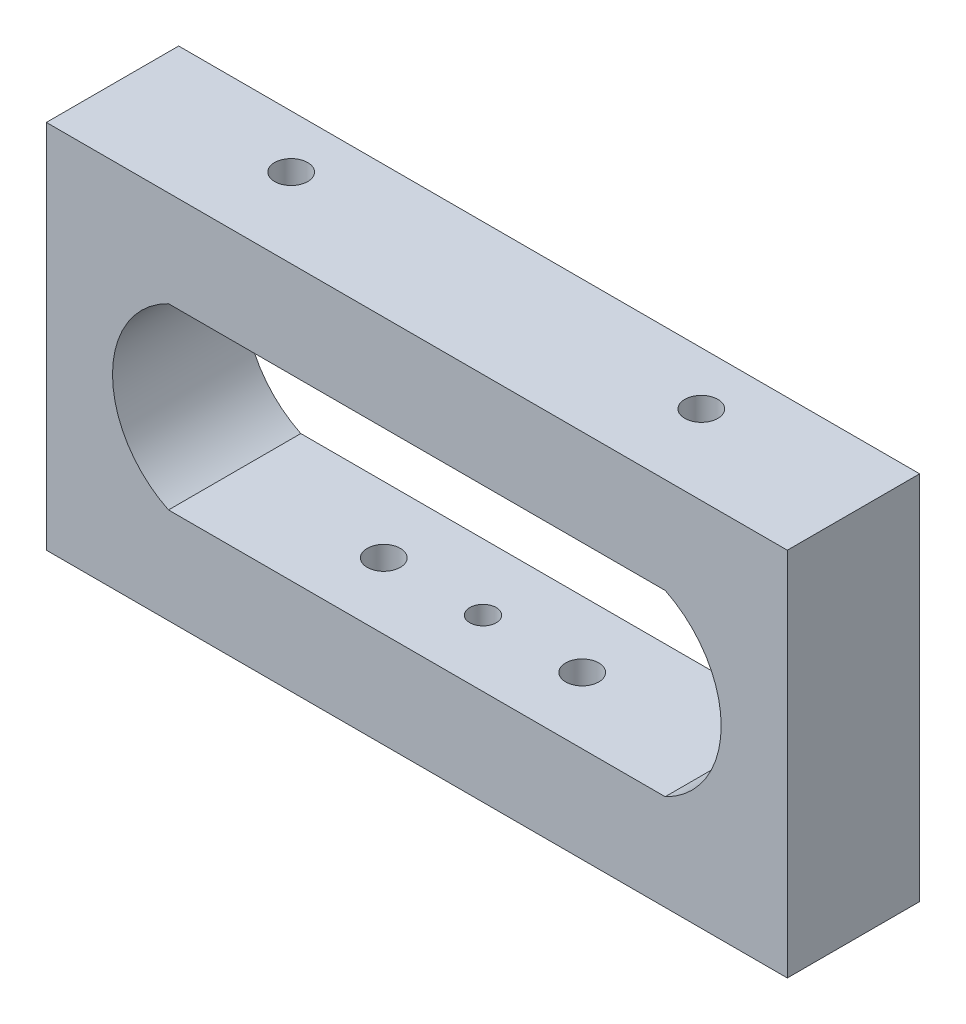
ISO-10303-21;
HEADER;
FILE_DESCRIPTION(('STEP AP214'),'2;1');
FILE_NAME('part.step','',(''),(''),'','','');
FILE_SCHEMA(('AUTOMOTIVE_DESIGN { 1 0 10303 214 1 1 1 1 }'));
ENDSEC;
DATA;
#1=APPLICATION_CONTEXT('core data for automotive mechanical design processes');
#2=APPLICATION_PROTOCOL_DEFINITION('international standard','automotive_design',2000,#1);
#3=PRODUCT_CONTEXT('',#1,'mechanical');
#4=PRODUCT('Part','Part','',(#3));
#5=PRODUCT_RELATED_PRODUCT_CATEGORY('part','',(#4));
#6=PRODUCT_DEFINITION_FORMATION('','',#4);
#7=PRODUCT_DEFINITION_CONTEXT('part definition',#1,'design');
#8=PRODUCT_DEFINITION('design','',#6,#7);
#9=PRODUCT_DEFINITION_SHAPE('','',#8);
#10=(LENGTH_UNIT() NAMED_UNIT(*) SI_UNIT(.MILLI.,.METRE.));
#11=(NAMED_UNIT(*) PLANE_ANGLE_UNIT() SI_UNIT($,.RADIAN.));
#12=(NAMED_UNIT(*) SI_UNIT($,.STERADIAN.) SOLID_ANGLE_UNIT());
#13=UNCERTAINTY_MEASURE_WITH_UNIT(LENGTH_MEASURE(1.E-05),#10,'distance_accuracy_value','');
#14=(GEOMETRIC_REPRESENTATION_CONTEXT(3) GLOBAL_UNCERTAINTY_ASSIGNED_CONTEXT((#13)) GLOBAL_UNIT_ASSIGNED_CONTEXT((#10,
#11,#12)) REPRESENTATION_CONTEXT('',''));
#15=CARTESIAN_POINT('',(0.,0.,0.));
#16=DIRECTION('',(0.,0.,1.));
#17=DIRECTION('',(1.,0.,0.));
#18=AXIS2_PLACEMENT_3D('',#15,#16,#17);
#19=CARTESIAN_POINT('',(-28.,14.,10.));
#20=DIRECTION('',(1.,0.,0.));
#21=DIRECTION('',(0.,0.,-1.));
#22=AXIS2_PLACEMENT_3D('',#19,#20,#21);
#23=PLANE('',#22);
#24=DIRECTION('',(0.,-1.,0.));
#25=VECTOR('',#24,1.);
#26=CARTESIAN_POINT('',(-28.,14.,0.));
#27=LINE('',#26,#25);
#28=CARTESIAN_POINT('',(-28.,14.,0.));
#29=VERTEX_POINT('',#28);
#30=CARTESIAN_POINT('',(-28.,-14.,0.));
#31=VERTEX_POINT('',#30);
#32=EDGE_CURVE('E134',#29,#31,#27,.T.);
#33=ORIENTED_EDGE('',*,*,#32,.T.);
#34=DIRECTION('',(0.,0.,-1.));
#35=VECTOR('',#34,1.);
#36=CARTESIAN_POINT('',(-28.,-14.,10.));
#37=LINE('',#36,#35);
#38=CARTESIAN_POINT('',(-28.,-14.,10.));
#39=VERTEX_POINT('',#38);
#40=EDGE_CURVE('E11',#39,#31,#37,.T.);
#41=ORIENTED_EDGE('',*,*,#40,.F.);
#42=DIRECTION('',(0.,-1.,0.));
#43=VECTOR('',#42,1.);
#44=CARTESIAN_POINT('',(-28.,14.,10.));
#45=LINE('',#44,#43);
#46=CARTESIAN_POINT('',(-28.,14.,10.));
#47=VERTEX_POINT('',#46);
#48=EDGE_CURVE('E138',#47,#39,#45,.T.);
#49=ORIENTED_EDGE('',*,*,#48,.F.);
#50=DIRECTION('',(0.,0.,-1.));
#51=VECTOR('',#50,1.);
#52=CARTESIAN_POINT('',(-28.,14.,10.));
#53=LINE('',#52,#51);
#54=EDGE_CURVE('E148',#47,#29,#53,.T.);
#55=ORIENTED_EDGE('',*,*,#54,.T.);
#56=EDGE_LOOP('',(#33,#41,#49,#55));
#57=FACE_BOUND('',#56,.T.);
#58=ADVANCED_FACE('F34',(#57),#23,.F.);
#59=CARTESIAN_POINT('',(-28.,-14.,10.));
#60=DIRECTION('',(0.,1.,0.));
#61=DIRECTION('',(0.,0.,1.));
#62=AXIS2_PLACEMENT_3D('',#59,#60,#61);
#63=PLANE('',#62);
#64=CARTESIAN_POINT('',(0.,-14.,5.));
#65=DIRECTION('',(0.,-1.,0.));
#66=DIRECTION('',(0.,0.,-1.));
#67=AXIS2_PLACEMENT_3D('',#64,#65,#66);
#68=CIRCLE('',#67,0.999999999999999);
#69=CARTESIAN_POINT('',(0.,-14.,4.));
#70=VERTEX_POINT('',#69);
#71=EDGE_CURVE('E233',#70,#70,#68,.T.);
#72=ORIENTED_EDGE('',*,*,#71,.F.);
#73=EDGE_LOOP('',(#72));
#74=FACE_BOUND('',#73,.T.);
#75=CARTESIAN_POINT('',(7.5,-14.,5.));
#76=DIRECTION('',(0.,-1.,0.));
#77=DIRECTION('',(0.,0.,-1.));
#78=AXIS2_PLACEMENT_3D('',#75,#76,#77);
#79=CIRCLE('',#78,1.25);
#80=CARTESIAN_POINT('',(7.5,-14.,3.75));
#81=VERTEX_POINT('',#80);
#82=EDGE_CURVE('E252',#81,#81,#79,.T.);
#83=ORIENTED_EDGE('',*,*,#82,.F.);
#84=EDGE_LOOP('',(#83));
#85=FACE_BOUND('',#84,.T.);
#86=CARTESIAN_POINT('',(-7.5,-14.,5.));
#87=DIRECTION('',(0.,-1.,0.));
#88=DIRECTION('',(0.,0.,-1.));
#89=AXIS2_PLACEMENT_3D('',#86,#87,#88);
#90=CIRCLE('',#89,1.25);
#91=CARTESIAN_POINT('',(-7.5,-14.,3.75));
#92=VERTEX_POINT('',#91);
#93=EDGE_CURVE('E257',#92,#92,#90,.T.);
#94=ORIENTED_EDGE('',*,*,#93,.F.);
#95=EDGE_LOOP('',(#94));
#96=FACE_BOUND('',#95,.T.);
#97=DIRECTION('',(1.,0.,0.));
#98=VECTOR('',#97,1.);
#99=CARTESIAN_POINT('',(-28.,-14.,0.));
#100=LINE('',#99,#98);
#101=CARTESIAN_POINT('',(28.,-14.,0.));
#102=VERTEX_POINT('',#101);
#103=EDGE_CURVE('E151',#31,#102,#100,.T.);
#104=ORIENTED_EDGE('',*,*,#103,.T.);
#105=DIRECTION('',(0.,0.,-1.));
#106=VECTOR('',#105,1.);
#107=CARTESIAN_POINT('',(28.,-14.,10.));
#108=LINE('',#107,#106);
#109=CARTESIAN_POINT('',(28.,-14.,10.));
#110=VERTEX_POINT('',#109);
#111=EDGE_CURVE('E41',#110,#102,#108,.T.);
#112=ORIENTED_EDGE('',*,*,#111,.F.);
#113=DIRECTION('',(1.,0.,0.));
#114=VECTOR('',#113,1.);
#115=CARTESIAN_POINT('',(-28.,-14.,10.));
#116=LINE('',#115,#114);
#117=EDGE_CURVE('E141',#39,#110,#116,.T.);
#118=ORIENTED_EDGE('',*,*,#117,.F.);
#119=ORIENTED_EDGE('',*,*,#40,.T.);
#120=EDGE_LOOP('',(#104,#112,#118,#119));
#121=FACE_BOUND('',#120,.T.);
#122=ADVANCED_FACE('F179',(#74,#85,#96,#121),#63,.F.);
#123=CARTESIAN_POINT('',(28.,14.,10.));
#124=DIRECTION('',(-1.,0.,0.));
#125=DIRECTION('',(0.,0.,1.));
#126=AXIS2_PLACEMENT_3D('',#123,#124,#125);
#127=PLANE('',#126);
#128=DIRECTION('',(0.,1.,0.));
#129=VECTOR('',#128,1.);
#130=CARTESIAN_POINT('',(28.,14.,0.));
#131=LINE('',#130,#129);
#132=CARTESIAN_POINT('',(28.,14.,0.));
#133=VERTEX_POINT('',#132);
#134=EDGE_CURVE('E153',#102,#133,#131,.T.);
#135=ORIENTED_EDGE('',*,*,#134,.T.);
#136=DIRECTION('',(0.,0.,-1.));
#137=VECTOR('',#136,1.);
#138=CARTESIAN_POINT('',(28.,14.,10.));
#139=LINE('',#138,#137);
#140=CARTESIAN_POINT('',(28.,14.,10.));
#141=VERTEX_POINT('',#140);
#142=EDGE_CURVE('E158',#141,#133,#139,.T.);
#143=ORIENTED_EDGE('',*,*,#142,.F.);
#144=DIRECTION('',(0.,1.,0.));
#145=VECTOR('',#144,1.);
#146=CARTESIAN_POINT('',(28.,14.,10.));
#147=LINE('',#146,#145);
#148=EDGE_CURVE('E144',#110,#141,#147,.T.);
#149=ORIENTED_EDGE('',*,*,#148,.F.);
#150=ORIENTED_EDGE('',*,*,#111,.T.);
#151=EDGE_LOOP('',(#135,#143,#149,#150));
#152=FACE_BOUND('',#151,.T.);
#153=ADVANCED_FACE('F165',(#152),#127,.F.);
#154=CARTESIAN_POINT('',(-28.,14.,10.));
#155=DIRECTION('',(0.,-1.,0.));
#156=DIRECTION('',(0.,0.,-1.));
#157=AXIS2_PLACEMENT_3D('',#154,#155,#156);
#158=PLANE('',#157);
#159=CARTESIAN_POINT('',(15.5,14.,4.00000000000001));
#160=DIRECTION('',(0.,1.,0.));
#161=DIRECTION('',(0.,0.,1.));
#162=AXIS2_PLACEMENT_3D('',#159,#160,#161);
#163=CIRCLE('',#162,1.25);
#164=CARTESIAN_POINT('',(15.5,14.,5.25));
#165=VERTEX_POINT('',#164);
#166=EDGE_CURVE('E237',#165,#165,#163,.T.);
#167=ORIENTED_EDGE('',*,*,#166,.F.);
#168=EDGE_LOOP('',(#167));
#169=FACE_BOUND('',#168,.T.);
#170=CARTESIAN_POINT('',(-15.5,14.,4.00000000000001));
#171=DIRECTION('',(0.,1.,0.));
#172=DIRECTION('',(0.,0.,1.));
#173=AXIS2_PLACEMENT_3D('',#170,#171,#172);
#174=CIRCLE('',#173,1.25);
#175=CARTESIAN_POINT('',(-15.5,14.,5.25));
#176=VERTEX_POINT('',#175);
#177=EDGE_CURVE('E246',#176,#176,#174,.T.);
#178=ORIENTED_EDGE('',*,*,#177,.F.);
#179=EDGE_LOOP('',(#178));
#180=FACE_BOUND('',#179,.T.);
#181=DIRECTION('',(-1.,0.,0.));
#182=VECTOR('',#181,1.);
#183=CARTESIAN_POINT('',(-28.,14.,0.));
#184=LINE('',#183,#182);
#185=EDGE_CURVE('E142',#133,#29,#184,.T.);
#186=ORIENTED_EDGE('',*,*,#185,.T.);
#187=ORIENTED_EDGE('',*,*,#54,.F.);
#188=DIRECTION('',(-1.,0.,0.));
#189=VECTOR('',#188,1.);
#190=CARTESIAN_POINT('',(-28.,14.,10.));
#191=LINE('',#190,#189);
#192=EDGE_CURVE('E146',#141,#47,#191,.T.);
#193=ORIENTED_EDGE('',*,*,#192,.F.);
#194=ORIENTED_EDGE('',*,*,#142,.T.);
#195=EDGE_LOOP('',(#186,#187,#193,#194));
#196=FACE_BOUND('',#195,.T.);
#197=ADVANCED_FACE('F174',(#169,#180,#196),#158,.F.);
#198=CARTESIAN_POINT('',(0.,0.,10.));
#199=DIRECTION('',(0.,0.,1.));
#200=DIRECTION('',(1.,0.,0.));
#201=AXIS2_PLACEMENT_3D('',#198,#199,#200);
#202=PLANE('',#201);
#203=CARTESIAN_POINT('',(15.5,0.,10.));
#204=DIRECTION('',(0.,0.,-1.));
#205=DIRECTION('',(-1.,0.,0.));
#206=AXIS2_PLACEMENT_3D('',#203,#204,#205);
#207=CIRCLE('',#206,7.5);
#208=CARTESIAN_POINT('',(18.7691742076555,6.75,10.));
#209=VERTEX_POINT('',#208);
#210=CARTESIAN_POINT('',(18.7691742076555,-6.75,10.));
#211=VERTEX_POINT('',#210);
#212=EDGE_CURVE('E100',#209,#211,#207,.T.);
#213=ORIENTED_EDGE('',*,*,#212,.T.);
#214=DIRECTION('',(-1.,0.,0.));
#215=VECTOR('',#214,1.);
#216=CARTESIAN_POINT('',(18.7691742076555,-6.75,10.));
#217=LINE('',#216,#215);
#218=CARTESIAN_POINT('',(-18.7691742076555,-6.75,10.));
#219=VERTEX_POINT('',#218);
#220=EDGE_CURVE('E109',#211,#219,#217,.T.);
#221=ORIENTED_EDGE('',*,*,#220,.T.);
#222=CARTESIAN_POINT('',(-15.5,0.,10.));
#223=DIRECTION('',(0.,0.,-1.));
#224=DIRECTION('',(1.,0.,0.));
#225=AXIS2_PLACEMENT_3D('',#222,#223,#224);
#226=CIRCLE('',#225,7.5);
#227=CARTESIAN_POINT('',(-18.7691742076555,6.75,10.));
#228=VERTEX_POINT('',#227);
#229=EDGE_CURVE('E48',#219,#228,#226,.T.);
#230=ORIENTED_EDGE('',*,*,#229,.T.);
#231=DIRECTION('',(1.,0.,0.));
#232=VECTOR('',#231,1.);
#233=CARTESIAN_POINT('',(18.7691742076555,6.75,10.));
#234=LINE('',#233,#232);
#235=EDGE_CURVE('E106',#228,#209,#234,.T.);
#236=ORIENTED_EDGE('',*,*,#235,.T.);
#237=EDGE_LOOP('',(#213,#221,#230,#236));
#238=FACE_BOUND('',#237,.T.);
#239=ORIENTED_EDGE('',*,*,#48,.T.);
#240=ORIENTED_EDGE('',*,*,#117,.T.);
#241=ORIENTED_EDGE('',*,*,#148,.T.);
#242=ORIENTED_EDGE('',*,*,#192,.T.);
#243=EDGE_LOOP('',(#239,#240,#241,#242));
#244=FACE_BOUND('',#243,.T.);
#245=ADVANCED_FACE('F113',(#238,#244),#202,.T.);
#246=CARTESIAN_POINT('',(0.,0.,0.));
#247=DIRECTION('',(0.,0.,1.));
#248=DIRECTION('',(1.,0.,0.));
#249=AXIS2_PLACEMENT_3D('',#246,#247,#248);
#250=PLANE('',#249);
#251=DIRECTION('',(-1.,0.,0.));
#252=VECTOR('',#251,1.);
#253=CARTESIAN_POINT('',(18.7691742076555,-6.75,0.));
#254=LINE('',#253,#252);
#255=CARTESIAN_POINT('',(18.7691742076555,-6.75,0.));
#256=VERTEX_POINT('',#255);
#257=CARTESIAN_POINT('',(-18.7691742076555,-6.75,0.));
#258=VERTEX_POINT('',#257);
#259=EDGE_CURVE('E128',#256,#258,#254,.T.);
#260=ORIENTED_EDGE('',*,*,#259,.F.);
#261=CARTESIAN_POINT('',(15.5,0.,0.));
#262=DIRECTION('',(0.,0.,-1.));
#263=DIRECTION('',(-1.,0.,0.));
#264=AXIS2_PLACEMENT_3D('',#261,#262,#263);
#265=CIRCLE('',#264,7.5);
#266=CARTESIAN_POINT('',(18.7691742076555,6.75,0.));
#267=VERTEX_POINT('',#266);
#268=EDGE_CURVE('E56',#267,#256,#265,.T.);
#269=ORIENTED_EDGE('',*,*,#268,.F.);
#270=DIRECTION('',(1.,0.,0.));
#271=VECTOR('',#270,1.);
#272=CARTESIAN_POINT('',(18.7691742076555,6.75,0.));
#273=LINE('',#272,#271);
#274=CARTESIAN_POINT('',(-18.7691742076555,6.75,0.));
#275=VERTEX_POINT('',#274);
#276=EDGE_CURVE('E116',#275,#267,#273,.T.);
#277=ORIENTED_EDGE('',*,*,#276,.F.);
#278=CARTESIAN_POINT('',(-15.5,0.,0.));
#279=DIRECTION('',(0.,0.,-1.));
#280=DIRECTION('',(1.,0.,0.));
#281=AXIS2_PLACEMENT_3D('',#278,#279,#280);
#282=CIRCLE('',#281,7.5);
#283=EDGE_CURVE('E119',#258,#275,#282,.T.);
#284=ORIENTED_EDGE('',*,*,#283,.F.);
#285=EDGE_LOOP('',(#260,#269,#277,#284));
#286=FACE_BOUND('',#285,.T.);
#287=ORIENTED_EDGE('',*,*,#32,.F.);
#288=ORIENTED_EDGE('',*,*,#185,.F.);
#289=ORIENTED_EDGE('',*,*,#134,.F.);
#290=ORIENTED_EDGE('',*,*,#103,.F.);
#291=EDGE_LOOP('',(#287,#288,#289,#290));
#292=FACE_BOUND('',#291,.T.);
#293=ADVANCED_FACE('F171',(#286,#292),#250,.F.);
#294=CARTESIAN_POINT('',(15.5,0.,10.));
#295=DIRECTION('',(0.,0.,-1.));
#296=DIRECTION('',(-1.,0.,0.));
#297=AXIS2_PLACEMENT_3D('',#294,#295,#296);
#298=CYLINDRICAL_SURFACE('',#297,7.5);
#299=ORIENTED_EDGE('',*,*,#268,.T.);
#300=DIRECTION('',(0.,0.,-1.));
#301=VECTOR('',#300,1.);
#302=CARTESIAN_POINT('',(18.7691742076555,-6.75,10.));
#303=LINE('',#302,#301);
#304=EDGE_CURVE('E96',#211,#256,#303,.T.);
#305=ORIENTED_EDGE('',*,*,#304,.F.);
#306=ORIENTED_EDGE('',*,*,#212,.F.);
#307=DIRECTION('',(0.,0.,-1.));
#308=VECTOR('',#307,1.);
#309=CARTESIAN_POINT('',(18.7691742076555,6.75,10.));
#310=LINE('',#309,#308);
#311=EDGE_CURVE('E132',#209,#267,#310,.T.);
#312=ORIENTED_EDGE('',*,*,#311,.T.);
#313=EDGE_LOOP('',(#299,#305,#306,#312));
#314=FACE_BOUND('',#313,.T.);
#315=ADVANCED_FACE('F98',(#314),#298,.F.);
#316=CARTESIAN_POINT('',(18.7691742076555,6.75,10.));
#317=DIRECTION('',(0.,1.,0.));
#318=DIRECTION('',(0.,0.,1.));
#319=AXIS2_PLACEMENT_3D('',#316,#317,#318);
#320=PLANE('',#319);
#321=CARTESIAN_POINT('',(15.5,6.75,4.00000000000001));
#322=DIRECTION('',(0.,1.,0.));
#323=DIRECTION('',(0.,0.,1.));
#324=AXIS2_PLACEMENT_3D('',#321,#322,#323);
#325=CIRCLE('',#324,1.25);
#326=CARTESIAN_POINT('',(15.5,6.75,5.25));
#327=VERTEX_POINT('',#326);
#328=EDGE_CURVE('E240',#327,#327,#325,.T.);
#329=ORIENTED_EDGE('',*,*,#328,.T.);
#330=EDGE_LOOP('',(#329));
#331=FACE_BOUND('',#330,.T.);
#332=CARTESIAN_POINT('',(-15.5,6.75,4.00000000000001));
#333=DIRECTION('',(0.,1.,0.));
#334=DIRECTION('',(0.,0.,1.));
#335=AXIS2_PLACEMENT_3D('',#332,#333,#334);
#336=CIRCLE('',#335,1.25);
#337=CARTESIAN_POINT('',(-15.5,6.75,5.25));
#338=VERTEX_POINT('',#337);
#339=EDGE_CURVE('E249',#338,#338,#336,.T.);
#340=ORIENTED_EDGE('',*,*,#339,.T.);
#341=EDGE_LOOP('',(#340));
#342=FACE_BOUND('',#341,.T.);
#343=ORIENTED_EDGE('',*,*,#276,.T.);
#344=ORIENTED_EDGE('',*,*,#311,.F.);
#345=ORIENTED_EDGE('',*,*,#235,.F.);
#346=DIRECTION('',(0.,0.,-1.));
#347=VECTOR('',#346,1.);
#348=CARTESIAN_POINT('',(-18.7691742076555,6.75,10.));
#349=LINE('',#348,#347);
#350=EDGE_CURVE('E135',#228,#275,#349,.T.);
#351=ORIENTED_EDGE('',*,*,#350,.T.);
#352=EDGE_LOOP('',(#343,#344,#345,#351));
#353=FACE_BOUND('',#352,.T.);
#354=ADVANCED_FACE('F200',(#331,#342,#353),#320,.F.);
#355=CARTESIAN_POINT('',(-15.5,0.,10.));
#356=DIRECTION('',(0.,0.,-1.));
#357=DIRECTION('',(-1.,0.,0.));
#358=AXIS2_PLACEMENT_3D('',#355,#356,#357);
#359=CYLINDRICAL_SURFACE('',#358,7.5);
#360=ORIENTED_EDGE('',*,*,#283,.T.);
#361=ORIENTED_EDGE('',*,*,#350,.F.);
#362=ORIENTED_EDGE('',*,*,#229,.F.);
#363=DIRECTION('',(0.,0.,-1.));
#364=VECTOR('',#363,1.);
#365=CARTESIAN_POINT('',(-18.7691742076555,-6.75,10.));
#366=LINE('',#365,#364);
#367=EDGE_CURVE('E105',#219,#258,#366,.T.);
#368=ORIENTED_EDGE('',*,*,#367,.T.);
#369=EDGE_LOOP('',(#360,#361,#362,#368));
#370=FACE_BOUND('',#369,.T.);
#371=ADVANCED_FACE('F204',(#370),#359,.F.);
#372=CARTESIAN_POINT('',(18.7691742076555,-6.75,10.));
#373=DIRECTION('',(0.,-1.,0.));
#374=DIRECTION('',(0.,0.,-1.));
#375=AXIS2_PLACEMENT_3D('',#372,#373,#374);
#376=PLANE('',#375);
#377=CARTESIAN_POINT('',(0.,-6.75,5.));
#378=DIRECTION('',(0.,-1.,0.));
#379=DIRECTION('',(0.,0.,-1.));
#380=AXIS2_PLACEMENT_3D('',#377,#378,#379);
#381=CIRCLE('',#380,0.999999999999998);
#382=CARTESIAN_POINT('',(0.,-6.75,4.00000000000001));
#383=VERTEX_POINT('',#382);
#384=EDGE_CURVE('E236',#383,#383,#381,.T.);
#385=ORIENTED_EDGE('',*,*,#384,.T.);
#386=EDGE_LOOP('',(#385));
#387=FACE_BOUND('',#386,.T.);
#388=CARTESIAN_POINT('',(7.5,-6.75,5.));
#389=DIRECTION('',(0.,-1.,0.));
#390=DIRECTION('',(0.,0.,-1.));
#391=AXIS2_PLACEMENT_3D('',#388,#389,#390);
#392=CIRCLE('',#391,1.25);
#393=CARTESIAN_POINT('',(7.5,-6.75,3.75));
#394=VERTEX_POINT('',#393);
#395=EDGE_CURVE('E255',#394,#394,#392,.T.);
#396=ORIENTED_EDGE('',*,*,#395,.T.);
#397=EDGE_LOOP('',(#396));
#398=FACE_BOUND('',#397,.T.);
#399=CARTESIAN_POINT('',(-7.5,-6.75,5.));
#400=DIRECTION('',(0.,-1.,0.));
#401=DIRECTION('',(0.,0.,-1.));
#402=AXIS2_PLACEMENT_3D('',#399,#400,#401);
#403=CIRCLE('',#402,1.25);
#404=CARTESIAN_POINT('',(-7.5,-6.75,3.75));
#405=VERTEX_POINT('',#404);
#406=EDGE_CURVE('E122',#405,#405,#403,.T.);
#407=ORIENTED_EDGE('',*,*,#406,.T.);
#408=EDGE_LOOP('',(#407));
#409=FACE_BOUND('',#408,.T.);
#410=ORIENTED_EDGE('',*,*,#259,.T.);
#411=ORIENTED_EDGE('',*,*,#367,.F.);
#412=ORIENTED_EDGE('',*,*,#220,.F.);
#413=ORIENTED_EDGE('',*,*,#304,.T.);
#414=EDGE_LOOP('',(#410,#411,#412,#413));
#415=FACE_BOUND('',#414,.T.);
#416=ADVANCED_FACE('F110',(#387,#398,#409,#415),#376,.F.);
#417=CARTESIAN_POINT('',(-7.5,-14.,5.));
#418=DIRECTION('',(0.,-1.,0.));
#419=DIRECTION('',(0.,0.,-1.));
#420=AXIS2_PLACEMENT_3D('',#417,#418,#419);
#421=CYLINDRICAL_SURFACE('',#420,1.25);
#422=ORIENTED_EDGE('',*,*,#93,.T.);
#423=EDGE_LOOP('',(#422));
#424=FACE_BOUND('',#423,.T.);
#425=ORIENTED_EDGE('',*,*,#406,.F.);
#426=EDGE_LOOP('',(#425));
#427=FACE_BOUND('',#426,.T.);
#428=ADVANCED_FACE('F203',(#424,#427),#421,.F.);
#429=CARTESIAN_POINT('',(7.5,-14.,5.));
#430=DIRECTION('',(0.,-1.,0.));
#431=DIRECTION('',(0.,0.,-1.));
#432=AXIS2_PLACEMENT_3D('',#429,#430,#431);
#433=CYLINDRICAL_SURFACE('',#432,1.25);
#434=ORIENTED_EDGE('',*,*,#82,.T.);
#435=EDGE_LOOP('',(#434));
#436=FACE_BOUND('',#435,.T.);
#437=ORIENTED_EDGE('',*,*,#395,.F.);
#438=EDGE_LOOP('',(#437));
#439=FACE_BOUND('',#438,.T.);
#440=ADVANCED_FACE('F213',(#436,#439),#433,.F.);
#441=CARTESIAN_POINT('',(-15.5,14.,4.00000000000001));
#442=DIRECTION('',(0.,1.,0.));
#443=DIRECTION('',(0.,0.,1.));
#444=AXIS2_PLACEMENT_3D('',#441,#442,#443);
#445=CYLINDRICAL_SURFACE('',#444,1.25);
#446=ORIENTED_EDGE('',*,*,#339,.F.);
#447=EDGE_LOOP('',(#446));
#448=FACE_BOUND('',#447,.T.);
#449=ORIENTED_EDGE('',*,*,#177,.T.);
#450=EDGE_LOOP('',(#449));
#451=FACE_BOUND('',#450,.T.);
#452=ADVANCED_FACE('F217',(#448,#451),#445,.F.);
#453=CARTESIAN_POINT('',(15.5,14.,4.00000000000001));
#454=DIRECTION('',(0.,1.,0.));
#455=DIRECTION('',(0.,0.,1.));
#456=AXIS2_PLACEMENT_3D('',#453,#454,#455);
#457=CYLINDRICAL_SURFACE('',#456,1.25);
#458=ORIENTED_EDGE('',*,*,#328,.F.);
#459=EDGE_LOOP('',(#458));
#460=FACE_BOUND('',#459,.T.);
#461=ORIENTED_EDGE('',*,*,#166,.T.);
#462=EDGE_LOOP('',(#461));
#463=FACE_BOUND('',#462,.T.);
#464=ADVANCED_FACE('F221',(#460,#463),#457,.F.);
#465=CARTESIAN_POINT('',(0.,-14.,5.));
#466=DIRECTION('',(0.,-1.,0.));
#467=DIRECTION('',(0.,0.,-1.));
#468=AXIS2_PLACEMENT_3D('',#465,#466,#467);
#469=CYLINDRICAL_SURFACE('',#468,0.999999999999998);
#470=ORIENTED_EDGE('',*,*,#71,.T.);
#471=EDGE_LOOP('',(#470));
#472=FACE_BOUND('',#471,.T.);
#473=ORIENTED_EDGE('',*,*,#384,.F.);
#474=EDGE_LOOP('',(#473));
#475=FACE_BOUND('',#474,.T.);
#476=ADVANCED_FACE('F225',(#472,#475),#469,.F.);
#477=CLOSED_SHELL('',(#58,#122,#153,#197,#245,#293,#315,#354,#371,#416,#428,#440,#452,#464,#476));
#478=MANIFOLD_SOLID_BREP('B2',#477);
#479=ADVANCED_BREP_SHAPE_REPRESENTATION('',(#18,#478),#14);
#480=SHAPE_DEFINITION_REPRESENTATION(#9,#479);
ENDSEC;
END-ISO-10303-21;
